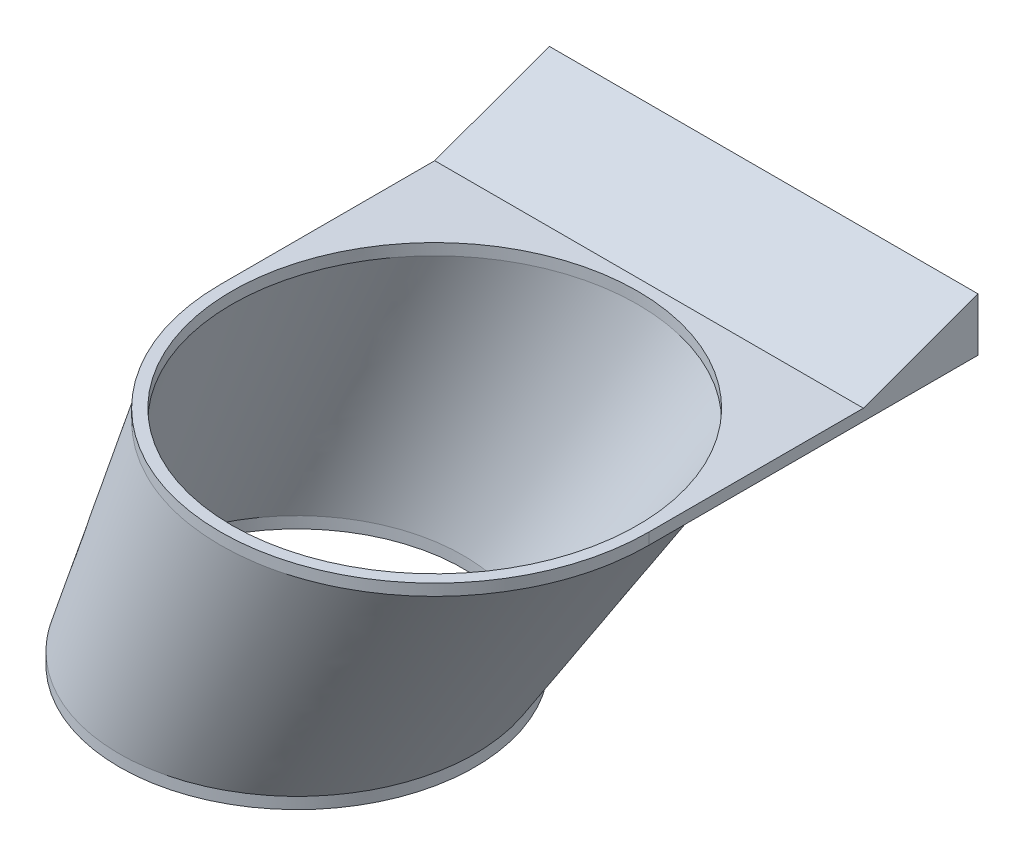
ISO-10303-21;
HEADER;
FILE_DESCRIPTION(('STEP AP214'),'2;1');
FILE_NAME('part.step','',(''),(''),'','','');
FILE_SCHEMA(('AUTOMOTIVE_DESIGN { 1 0 10303 214 1 1 1 1 }'));
ENDSEC;
DATA;
#1=APPLICATION_CONTEXT('core data for automotive mechanical design processes');
#2=APPLICATION_PROTOCOL_DEFINITION('international standard','automotive_design',2000,#1);
#3=PRODUCT_CONTEXT('',#1,'mechanical');
#4=PRODUCT('Part','Part','',(#3));
#5=PRODUCT_RELATED_PRODUCT_CATEGORY('part','',(#4));
#6=PRODUCT_DEFINITION_FORMATION('','',#4);
#7=PRODUCT_DEFINITION_CONTEXT('part definition',#1,'design');
#8=PRODUCT_DEFINITION('design','',#6,#7);
#9=PRODUCT_DEFINITION_SHAPE('','',#8);
#10=(LENGTH_UNIT() NAMED_UNIT(*) SI_UNIT(.MILLI.,.METRE.));
#11=(NAMED_UNIT(*) PLANE_ANGLE_UNIT() SI_UNIT($,.RADIAN.));
#12=(NAMED_UNIT(*) SI_UNIT($,.STERADIAN.) SOLID_ANGLE_UNIT());
#13=UNCERTAINTY_MEASURE_WITH_UNIT(LENGTH_MEASURE(1.E-05),#10,'distance_accuracy_value','');
#14=(GEOMETRIC_REPRESENTATION_CONTEXT(3) GLOBAL_UNCERTAINTY_ASSIGNED_CONTEXT((#13)) GLOBAL_UNIT_ASSIGNED_CONTEXT((#10,
#11,#12)) REPRESENTATION_CONTEXT('',''));
#15=CARTESIAN_POINT('',(0.,0.,0.));
#16=DIRECTION('',(0.,0.,1.));
#17=DIRECTION('',(1.,0.,0.));
#18=AXIS2_PLACEMENT_3D('',#15,#16,#17);
#19=CARTESIAN_POINT('',(0.,2.54,0.));
#20=DIRECTION('',(0.,-1.,0.));
#21=DIRECTION('',(0.,0.,-1.));
#22=AXIS2_PLACEMENT_3D('',#19,#20,#21);
#23=CYLINDRICAL_SURFACE('',#22,47.498);
#24=DIRECTION('',(0.,-1.,0.));
#25=VECTOR('',#24,1.);
#26=CARTESIAN_POINT('',(47.498,2.54,0.));
#27=LINE('',#26,#25);
#28=CARTESIAN_POINT('',(47.498,2.54,0.));
#29=VERTEX_POINT('',#28);
#30=CARTESIAN_POINT('',(47.498,0.,0.));
#31=VERTEX_POINT('',#30);
#32=EDGE_CURVE('E290',#29,#31,#27,.T.);
#33=ORIENTED_EDGE('',*,*,#32,.F.);
#34=CARTESIAN_POINT('',(0.,2.54,0.));
#35=DIRECTION('',(0.,1.,0.));
#36=DIRECTION('',(0.,0.,1.));
#37=AXIS2_PLACEMENT_3D('',#34,#35,#36);
#38=CIRCLE('',#37,47.498);
#39=CARTESIAN_POINT('',(-47.498,2.54,0.));
#40=VERTEX_POINT('',#39);
#41=EDGE_CURVE('E237',#40,#29,#38,.T.);
#42=ORIENTED_EDGE('',*,*,#41,.F.);
#43=DIRECTION('',(0.,-1.,0.));
#44=VECTOR('',#43,1.);
#45=CARTESIAN_POINT('',(-47.498,2.54,0.));
#46=LINE('',#45,#44);
#47=CARTESIAN_POINT('',(-47.498,0.,0.));
#48=VERTEX_POINT('',#47);
#49=EDGE_CURVE('E148',#40,#48,#46,.T.);
#50=ORIENTED_EDGE('',*,*,#49,.T.);
#51=CARTESIAN_POINT('',(0.,0.,0.));
#52=DIRECTION('',(0.,1.,0.));
#53=DIRECTION('',(0.,0.,1.));
#54=AXIS2_PLACEMENT_3D('',#51,#52,#53);
#55=CIRCLE('',#54,47.498);
#56=EDGE_CURVE('E88',#48,#31,#55,.T.);
#57=ORIENTED_EDGE('',*,*,#56,.T.);
#58=EDGE_LOOP('',(#33,#42,#50,#57));
#59=FACE_BOUND('',#58,.T.);
#60=ADVANCED_FACE('F83',(#59),#23,.T.);
#61=CARTESIAN_POINT('',(-30.48,-59.3725,0.));
#62=DIRECTION('',(0.,-1.,0.));
#63=DIRECTION('',(0.,0.,-1.));
#64=AXIS2_PLACEMENT_3D('',#61,#62,#63);
#65=CYLINDRICAL_SURFACE('',#64,39.37);
#66=CARTESIAN_POINT('',(-69.85,-59.3725,0.));
#67=CARTESIAN_POINT('',(-69.85,-59.3725,1.08644469703361));
#68=CARTESIAN_POINT('',(-69.7617944697033,-59.3725,3.23889515169413));
#69=CARTESIAN_POINT('',(-69.375034572002,-59.3725,6.39608902683125));
#70=CARTESIAN_POINT('',(-68.7439880606777,-59.3725,9.47163610648123));
#71=CARTESIAN_POINT('',(-63.552979242795,-59.3725,27.3740478796573));
#72=CARTESIAN_POINT('',(-47.863115152538,-59.3725,39.37));
#73=CARTESIAN_POINT('',(-8.75110605932756,-59.3725,39.37));
#74=CARTESIAN_POINT('',(8.89,-59.3725,21.7288939406725));
#75=CARTESIAN_POINT('',(8.89000000000001,-59.3725,-21.7288939406724));
#76=CARTESIAN_POINT('',(-8.75110605932754,-59.3725,-39.37));
#77=CARTESIAN_POINT('',(-47.8631151525379,-59.3725,-39.37));
#78=CARTESIAN_POINT('',(-63.552979242795,-59.3725,-27.3740478796573));
#79=CARTESIAN_POINT('',(-68.7439880606777,-59.3725,-9.47163610648125));
#80=CARTESIAN_POINT('',(-69.375034572002,-59.3725,-6.39608902683127));
#81=CARTESIAN_POINT('',(-69.7617944697033,-59.3725,-3.23889515169414));
#82=CARTESIAN_POINT('',(-69.85,-59.3725,-1.08644469703363));
#83=CARTESIAN_POINT('',(-69.85,-59.3725,0.));
#84=B_SPLINE_CURVE_WITH_KNOTS('',3,(#66,#67,#68,#69,#70,#71,#72,#73,#74,#75,#76,#77,#78,#79,#80,
#81,#82,#83),.UNSPECIFIED.,.T.,.F.,(4,1,1,1,1,2,2,2,1,1,1,1,4),(0.,0.0125,0.025,0.0375,0.05,
0.25,0.5,0.75,0.95,0.9625,0.975,0.9875,1.),.UNSPECIFIED.);
#85=CARTESIAN_POINT('',(-69.85,-59.3725,0.));
#86=VERTEX_POINT('',#85);
#87=EDGE_CURVE('E13',#86,#86,#84,.T.);
#88=ORIENTED_EDGE('',*,*,#87,.F.);
#89=EDGE_LOOP('',(#88));
#90=FACE_BOUND('',#89,.T.);
#91=CARTESIAN_POINT('',(-30.48,-61.9125,0.));
#92=DIRECTION('',(0.,1.,0.));
#93=DIRECTION('',(0.,0.,1.));
#94=AXIS2_PLACEMENT_3D('',#91,#92,#93);
#95=CIRCLE('',#94,39.37);
#96=CARTESIAN_POINT('',(-30.48,-61.9125,39.37));
#97=VERTEX_POINT('',#96);
#98=EDGE_CURVE('E94',#97,#97,#95,.T.);
#99=ORIENTED_EDGE('',*,*,#98,.T.);
#100=EDGE_LOOP('',(#99));
#101=FACE_BOUND('',#100,.T.);
#102=ADVANCED_FACE('F85',(#90,#101),#65,.T.);
#103=CARTESIAN_POINT('',(-30.48,-61.9125,0.));
#104=DIRECTION('',(0.,1.,0.));
#105=DIRECTION('',(0.,0.,1.));
#106=AXIS2_PLACEMENT_3D('',#103,#104,#105);
#107=PLANE('',#106);
#108=CARTESIAN_POINT('',(-30.48,-61.9125,0.));
#109=DIRECTION('',(0.,1.,0.));
#110=DIRECTION('',(0.,0.,1.));
#111=AXIS2_PLACEMENT_3D('',#108,#109,#110);
#112=CIRCLE('',#111,36.83);
#113=CARTESIAN_POINT('',(-30.48,-61.9125,36.83));
#114=VERTEX_POINT('',#113);
#115=EDGE_CURVE('E166',#114,#114,#112,.T.);
#116=ORIENTED_EDGE('',*,*,#115,.T.);
#117=EDGE_LOOP('',(#116));
#118=FACE_BOUND('',#117,.T.);
#119=ORIENTED_EDGE('',*,*,#98,.F.);
#120=EDGE_LOOP('',(#119));
#121=FACE_BOUND('',#120,.T.);
#122=ADVANCED_FACE('F210',(#118,#121),#107,.F.);
#123=CARTESIAN_POINT('',(-30.48,-61.9125,0.));
#124=DIRECTION('',(0.,1.,0.));
#125=DIRECTION('',(0.,0.,1.));
#126=AXIS2_PLACEMENT_3D('',#123,#124,#125);
#127=CYLINDRICAL_SURFACE('',#126,36.83);
#128=ORIENTED_EDGE('',*,*,#115,.F.);
#129=EDGE_LOOP('',(#128));
#130=FACE_BOUND('',#129,.T.);
#131=CARTESIAN_POINT('',(-30.48,-59.3725,0.));
#132=DIRECTION('',(0.,-1.,0.));
#133=DIRECTION('',(0.,0.,-1.));
#134=AXIS2_PLACEMENT_3D('',#131,#132,#133);
#135=CIRCLE('',#134,36.83);
#136=CARTESIAN_POINT('',(-67.31,-59.3725,0.));
#137=VERTEX_POINT('',#136);
#138=EDGE_CURVE('E194',#137,#137,#135,.T.);
#139=ORIENTED_EDGE('',*,*,#138,.F.);
#140=EDGE_LOOP('',(#139));
#141=FACE_BOUND('',#140,.T.);
#142=ADVANCED_FACE('F201',(#130,#141),#127,.F.);
#143=CARTESIAN_POINT('',(-47.498,0.,0.));
#144=CARTESIAN_POINT('',(-54.9486666666667,-19.7908333333333,0.));
#145=CARTESIAN_POINT('',(-62.3993333333333,-39.5816666666667,0.));
#146=CARTESIAN_POINT('',(-69.85,-59.3725,0.));
#147=CARTESIAN_POINT('',(-47.498,0.,-1.31074295706638));
#148=CARTESIAN_POINT('',(-54.9486666666667,-19.7908333333333,-1.2359768703888));
#149=CARTESIAN_POINT('',(-62.3993333333333,-39.5816666666667,-1.16121078371121));
#150=CARTESIAN_POINT('',(-69.85,-59.3725,-1.08644469703363));
#151=CARTESIAN_POINT('',(-47.3915842957066,0.,-3.90757027978584));
#152=CARTESIAN_POINT('',(-54.8483210203722,-19.7908333333333,-3.68467857042194));
#153=CARTESIAN_POINT('',(-62.3050577450378,-39.5816666666667,-3.46178686105804));
#154=CARTESIAN_POINT('',(-69.7617944697033,-59.3725,-3.23889515169414));
#155=CARTESIAN_POINT('',(-46.9249771933185,0.,-7.71657192269321));
#156=CARTESIAN_POINT('',(-54.4083296528797,-19.7908333333333,-7.2764109574059));
#157=CARTESIAN_POINT('',(-61.8916821124408,-39.5816666666667,-6.83624999211859));
#158=CARTESIAN_POINT('',(-69.375034572002,-59.3725,-6.39608902683127));
#159=CARTESIAN_POINT('',(-46.1636501119143,0.,-11.4270706574967));
#160=CARTESIAN_POINT('',(-53.6904294281688,-19.7908333333333,-10.7752591404916));
#161=CARTESIAN_POINT('',(-61.2172087444232,-39.5816666666667,-10.1234476234864));
#162=CARTESIAN_POINT('',(-68.7439880606777,-59.3725,-9.47163610648125));
#163=CARTESIAN_POINT('',(-39.9009491509849,0.,-33.0254642161027));
#164=CARTESIAN_POINT('',(-47.7849591815883,-19.7908333333333,-31.1416587706209));
#165=CARTESIAN_POINT('',(-55.6689692121916,-39.5816666666667,-29.2578533251391));
#166=CARTESIAN_POINT('',(-63.552979242795,-59.3725,-27.3740478796573));
#167=CARTESIAN_POINT('',(-20.9718873130619,0.,-47.498));
#168=CARTESIAN_POINT('',(-29.9356299262206,-19.7908333333333,-44.7886666666667));
#169=CARTESIAN_POINT('',(-38.8993725393793,-39.5816666666667,-42.0793333333333));
#170=CARTESIAN_POINT('',(-47.8631151525379,-59.3725,-39.37));
#171=CARTESIAN_POINT('',(26.2148591413274,0.,-47.498));
#172=CARTESIAN_POINT('',(14.5595374077758,-19.7908333333333,-44.7886666666667));
#173=CARTESIAN_POINT('',(2.90421567422411,-39.5816666666667,-42.0793333333333));
#174=CARTESIAN_POINT('',(-8.75110605932754,-59.3725,-39.37));
#175=CARTESIAN_POINT('',(47.498,0.,-26.2148591413274));
#176=CARTESIAN_POINT('',(34.6286666666667,-19.7908333333333,-24.7195374077757));
#177=CARTESIAN_POINT('',(21.7593333333333,-39.5816666666667,-23.2242156742241));
#178=CARTESIAN_POINT('',(8.89000000000001,-59.3725,-21.7288939406724));
#179=CARTESIAN_POINT('',(47.498,0.,26.2148591413274));
#180=CARTESIAN_POINT('',(34.6286666666667,-19.7908333333333,24.7195374077758));
#181=CARTESIAN_POINT('',(21.7593333333333,-39.5816666666667,23.2242156742241));
#182=CARTESIAN_POINT('',(8.89,-59.3725,21.7288939406725));
#183=CARTESIAN_POINT('',(26.2148591413274,0.,47.498));
#184=CARTESIAN_POINT('',(14.5595374077757,-19.7908333333333,44.7886666666667));
#185=CARTESIAN_POINT('',(2.90421567422409,-39.5816666666667,42.0793333333333));
#186=CARTESIAN_POINT('',(-8.75110605932756,-59.3725,39.37));
#187=CARTESIAN_POINT('',(-20.9718873130619,0.,47.498));
#188=CARTESIAN_POINT('',(-29.9356299262206,-19.7908333333333,44.7886666666667));
#189=CARTESIAN_POINT('',(-38.8993725393793,-39.5816666666667,42.0793333333333));
#190=CARTESIAN_POINT('',(-47.863115152538,-59.3725,39.37));
#191=CARTESIAN_POINT('',(-39.900949150985,0.,33.0254642161026));
#192=CARTESIAN_POINT('',(-47.7849591815883,-19.7908333333333,31.1416587706208));
#193=CARTESIAN_POINT('',(-55.6689692121917,-39.5816666666667,29.2578533251391));
#194=CARTESIAN_POINT('',(-63.552979242795,-59.3725,27.3740478796573));
#195=CARTESIAN_POINT('',(-46.1636501119143,0.,11.4270706574967));
#196=CARTESIAN_POINT('',(-53.6904294281688,-19.7908333333333,10.7752591404915));
#197=CARTESIAN_POINT('',(-61.2172087444232,-39.5816666666667,10.1234476234864));
#198=CARTESIAN_POINT('',(-68.7439880606777,-59.3725,9.47163610648123));
#199=CARTESIAN_POINT('',(-46.9249771933185,0.,7.71657192269318));
#200=CARTESIAN_POINT('',(-54.4083296528797,-19.7908333333333,7.27641095740587));
#201=CARTESIAN_POINT('',(-61.8916821124408,-39.5816666666667,6.83624999211856));
#202=CARTESIAN_POINT('',(-69.375034572002,-59.3725,6.39608902683125));
#203=CARTESIAN_POINT('',(-47.3915842957066,0.,3.90757027978582));
#204=CARTESIAN_POINT('',(-54.8483210203722,-19.7908333333333,3.68467857042192));
#205=CARTESIAN_POINT('',(-62.3050577450378,-39.5816666666667,3.46178686105803));
#206=CARTESIAN_POINT('',(-69.7617944697033,-59.3725,3.23889515169413));
#207=CARTESIAN_POINT('',(-47.498,0.,1.31074295706635));
#208=CARTESIAN_POINT('',(-54.9486666666667,-19.7908333333333,1.23597687038877));
#209=CARTESIAN_POINT('',(-62.3993333333333,-39.5816666666667,1.16121078371119));
#210=CARTESIAN_POINT('',(-69.85,-59.3725,1.08644469703361));
#211=CARTESIAN_POINT('',(-47.498,0.,0.));
#212=CARTESIAN_POINT('',(-54.9486666666667,-19.7908333333333,0.));
#213=CARTESIAN_POINT('',(-62.3993333333333,-39.5816666666667,0.));
#214=CARTESIAN_POINT('',(-69.85,-59.3725,0.));
#215=B_SPLINE_SURFACE_WITH_KNOTS('',3,3,((#143,#144,#145,#146),(#147,#148,#149,#150),(#151,#152,
#153,#154),(#155,#156,#157,#158),(#159,#160,#161,#162),(#163,#164,#165,#166),(#167,#168,#169,
#170),(#171,#172,#173,#174),(#175,#176,#177,#178),(#179,#180,#181,#182),(#183,#184,#185,#186),
(#187,#188,#189,#190),(#191,#192,#193,#194),(#195,#196,#197,#198),(#199,#200,#201,#202),(#203,
#204,#205,#206),(#207,#208,#209,#210),(#211,#212,#213,#214)),.UNSPECIFIED.,.T.,.F.,.F.,(4,1,1,1,
1,2,2,2,1,1,1,1,4),(4,4),(0.,0.0125,0.0249999999999999,0.0375000000000001,0.05,0.25,0.5,0.75,
0.95,0.9625,0.975,0.9875,1.),(0.,1.),.UNSPECIFIED.);
#216=EDGE_CURVE('E152',#31,#48,#55,.T.);
#217=ORIENTED_EDGE('',*,*,#216,.F.);
#218=ORIENTED_EDGE('',*,*,#56,.F.);
#219=EDGE_LOOP('',(#217,#218));
#220=FACE_BOUND('',#219,.T.);
#221=ORIENTED_EDGE('',*,*,#87,.T.);
#222=EDGE_LOOP('',(#221));
#223=FACE_BOUND('',#222,.T.);
#224=ADVANCED_FACE('F209',(#220,#223),#215,.T.);
#225=CARTESIAN_POINT('',(0.,2.54,0.));
#226=DIRECTION('',(0.,1.,0.));
#227=DIRECTION('',(0.,0.,1.));
#228=AXIS2_PLACEMENT_3D('',#225,#226,#227);
#229=PLANE('',#228);
#230=DIRECTION('',(1.,0.,0.));
#231=VECTOR('',#230,1.);
#232=CARTESIAN_POINT('',(47.498,2.54,-47.498));
#233=LINE('',#232,#231);
#234=CARTESIAN_POINT('',(-47.498,2.54,-47.498));
#235=VERTEX_POINT('',#234);
#236=CARTESIAN_POINT('',(47.498,2.54,-47.498));
#237=VERTEX_POINT('',#236);
#238=EDGE_CURVE('E277',#235,#237,#233,.T.);
#239=ORIENTED_EDGE('',*,*,#238,.F.);
#240=DIRECTION('',(0.,0.,1.));
#241=VECTOR('',#240,1.);
#242=CARTESIAN_POINT('',(-47.498,2.54,0.));
#243=LINE('',#242,#241);
#244=EDGE_CURVE('E101',#235,#40,#243,.T.);
#245=ORIENTED_EDGE('',*,*,#244,.T.);
#246=ORIENTED_EDGE('',*,*,#41,.T.);
#247=DIRECTION('',(0.,0.,-1.));
#248=VECTOR('',#247,1.);
#249=CARTESIAN_POINT('',(47.498,2.54,0.));
#250=LINE('',#249,#248);
#251=EDGE_CURVE('E110',#29,#237,#250,.T.);
#252=ORIENTED_EDGE('',*,*,#251,.T.);
#253=EDGE_LOOP('',(#239,#245,#246,#252));
#254=FACE_BOUND('',#253,.T.);
#255=CARTESIAN_POINT('',(0.,2.54,0.));
#256=DIRECTION('',(0.,-1.,0.));
#257=DIRECTION('',(0.,0.,-1.));
#258=AXIS2_PLACEMENT_3D('',#255,#256,#257);
#259=CIRCLE('',#258,44.958);
#260=CARTESIAN_POINT('',(0.,2.54,-44.958));
#261=VERTEX_POINT('',#260);
#262=EDGE_CURVE('E280',#261,#261,#259,.T.);
#263=ORIENTED_EDGE('',*,*,#262,.T.);
#264=EDGE_LOOP('',(#263));
#265=FACE_BOUND('',#264,.T.);
#266=ADVANCED_FACE('F230',(#254,#265),#229,.T.);
#267=CARTESIAN_POINT('',(0.,2.54,0.));
#268=DIRECTION('',(0.,-1.,0.));
#269=DIRECTION('',(0.,0.,-1.));
#270=AXIS2_PLACEMENT_3D('',#267,#268,#269);
#271=CYLINDRICAL_SURFACE('',#270,44.958);
#272=ORIENTED_EDGE('',*,*,#262,.F.);
#273=EDGE_LOOP('',(#272));
#274=FACE_BOUND('',#273,.T.);
#275=CARTESIAN_POINT('',(0.,0.,0.));
#276=DIRECTION('',(0.,1.,0.));
#277=DIRECTION('',(0.,0.,1.));
#278=AXIS2_PLACEMENT_3D('',#275,#276,#277);
#279=CIRCLE('',#278,44.958);
#280=CARTESIAN_POINT('',(-44.958,0.,0.));
#281=VERTEX_POINT('',#280);
#282=EDGE_CURVE('E281',#281,#281,#279,.T.);
#283=ORIENTED_EDGE('',*,*,#282,.F.);
#284=EDGE_LOOP('',(#283));
#285=FACE_BOUND('',#284,.T.);
#286=ADVANCED_FACE('F267',(#274,#285),#271,.F.);
#287=CARTESIAN_POINT('',(-44.958,0.,0.));
#288=CARTESIAN_POINT('',(-52.4086666666667,-19.7908333333333,0.));
#289=CARTESIAN_POINT('',(-59.8593333333333,-39.5816666666667,0.));
#290=CARTESIAN_POINT('',(-67.31,-59.3725,0.));
#291=CARTESIAN_POINT('',(-44.958,0.,-1.24064975080615));
#292=CARTESIAN_POINT('',(-52.4086666666667,-19.7908333333333,-1.16588366412856));
#293=CARTESIAN_POINT('',(-59.8593333333333,-39.5816666666667,-1.09111757745097));
#294=CARTESIAN_POINT('',(-67.31,-59.3725,-1.01635149077339));
#295=CARTESIAN_POINT('',(-44.8572749750806,0.,-3.69860930225718));
#296=CARTESIAN_POINT('',(-52.3140116997462,-19.7908333333333,-3.47571759289328));
#297=CARTESIAN_POINT('',(-59.7707484244118,-39.5816666666667,-3.25282588352938));
#298=CARTESIAN_POINT('',(-67.2274851490773,-59.3725,-3.02993417416548));
#299=CARTESIAN_POINT('',(-44.4156201241571,0.,-7.30392101773636));
#300=CARTESIAN_POINT('',(-51.8989725837182,-19.7908333333333,-6.86376005244904));
#301=CARTESIAN_POINT('',(-59.3823250432794,-39.5816666666667,-6.42359908716172));
#302=CARTESIAN_POINT('',(-66.8656775028406,-59.3725,-5.98343812187441));
#303=CARTESIAN_POINT('',(-43.6950057209029,0.,-10.8159973603044));
#304=CARTESIAN_POINT('',(-51.2217850371573,-19.7908333333333,-10.1641858432992));
#305=CARTESIAN_POINT('',(-58.7485643534118,-39.5816666666667,-9.51237432629407));
#306=CARTESIAN_POINT('',(-66.2753436696662,-59.3725,-8.8605628092889));
#307=CARTESIAN_POINT('',(-37.7672085546756,0.,-31.2593966109635));
#308=CARTESIAN_POINT('',(-45.6512185852789,-19.7908333333333,-29.3755911654817));
#309=CARTESIAN_POINT('',(-53.5352286158823,-39.5816666666667,-27.4917857199999));
#310=CARTESIAN_POINT('',(-61.4192386464857,-59.3725,-25.6079802745181));
#311=CARTESIAN_POINT('',(-19.8503960128982,0.,-44.958));
#312=CARTESIAN_POINT('',(-28.8141386260568,-19.7908333333333,-42.2486666666667));
#313=CARTESIAN_POINT('',(-37.7778812392155,-39.5816666666667,-39.5393333333333));
#314=CARTESIAN_POINT('',(-46.7416238523742,-59.3725,-36.83));
#315=CARTESIAN_POINT('',(24.8129950161227,0.,-44.958));
#316=CARTESIAN_POINT('',(13.1576732825711,-19.7908333333333,-42.2486666666667));
#317=CARTESIAN_POINT('',(1.50235154901943,-39.5816666666667,-39.5393333333333));
#318=CARTESIAN_POINT('',(-10.1529701845322,-59.3725,-36.83));
#319=CARTESIAN_POINT('',(44.958,0.,-24.8129950161227));
#320=CARTESIAN_POINT('',(32.0886666666667,-19.7908333333333,-23.3176732825711));
#321=CARTESIAN_POINT('',(19.2193333333333,-39.5816666666667,-21.8223515490194));
#322=CARTESIAN_POINT('',(6.35000000000001,-59.3725,-20.3270298154678));
#323=CARTESIAN_POINT('',(44.958,0.,24.8129950161227));
#324=CARTESIAN_POINT('',(32.0886666666667,-19.7908333333333,23.3176732825711));
#325=CARTESIAN_POINT('',(19.2193333333333,-39.5816666666667,21.8223515490194));
#326=CARTESIAN_POINT('',(6.35,-59.3725,20.3270298154678));
#327=CARTESIAN_POINT('',(24.8129950161227,0.,44.958));
#328=CARTESIAN_POINT('',(13.1576732825711,-19.7908333333333,42.2486666666667));
#329=CARTESIAN_POINT('',(1.50235154901943,-39.5816666666667,39.5393333333333));
#330=CARTESIAN_POINT('',(-10.1529701845322,-59.3725,36.83));
#331=CARTESIAN_POINT('',(-19.8503960128982,0.,44.958));
#332=CARTESIAN_POINT('',(-28.8141386260569,-19.7908333333333,42.2486666666667));
#333=CARTESIAN_POINT('',(-37.7778812392155,-39.5816666666667,39.5393333333333));
#334=CARTESIAN_POINT('',(-46.7416238523742,-59.3725,36.83));
#335=CARTESIAN_POINT('',(-37.7672085546756,0.,31.2593966109635));
#336=CARTESIAN_POINT('',(-45.6512185852789,-19.7908333333333,29.3755911654817));
#337=CARTESIAN_POINT('',(-53.5352286158823,-39.5816666666667,27.4917857199999));
#338=CARTESIAN_POINT('',(-61.4192386464856,-59.3725,25.6079802745181));
#339=CARTESIAN_POINT('',(-43.6950057209029,0.,10.8159973603044));
#340=CARTESIAN_POINT('',(-51.2217850371573,-19.7908333333333,10.1641858432992));
#341=CARTESIAN_POINT('',(-58.7485643534117,-39.5816666666667,9.51237432629405));
#342=CARTESIAN_POINT('',(-66.2753436696662,-59.3725,8.8605628092889));
#343=CARTESIAN_POINT('',(-44.4156201241571,0.,7.30392101773633));
#344=CARTESIAN_POINT('',(-51.8989725837182,-19.7908333333333,6.86376005244902));
#345=CARTESIAN_POINT('',(-59.3823250432794,-39.5816666666667,6.42359908716171));
#346=CARTESIAN_POINT('',(-66.8656775028406,-59.3725,5.9834381218744));
#347=CARTESIAN_POINT('',(-44.8572749750806,0.,3.69860930225717));
#348=CARTESIAN_POINT('',(-52.3140116997462,-19.7908333333333,3.47571759289327));
#349=CARTESIAN_POINT('',(-59.7707484244118,-39.5816666666667,3.25282588352938));
#350=CARTESIAN_POINT('',(-67.2274851490773,-59.3725,3.02993417416548));
#351=CARTESIAN_POINT('',(-44.958,0.,1.24064975080612));
#352=CARTESIAN_POINT('',(-52.4086666666667,-19.7908333333333,1.16588366412854));
#353=CARTESIAN_POINT('',(-59.8593333333333,-39.5816666666667,1.09111757745096));
#354=CARTESIAN_POINT('',(-67.31,-59.3725,1.01635149077338));
#355=CARTESIAN_POINT('',(-44.958,0.,0.));
#356=CARTESIAN_POINT('',(-52.4086666666667,-19.7908333333333,0.));
#357=CARTESIAN_POINT('',(-59.8593333333333,-39.5816666666667,0.));
#358=CARTESIAN_POINT('',(-67.31,-59.3725,0.));
#359=B_SPLINE_SURFACE_WITH_KNOTS('',3,3,((#287,#288,#289,#290),(#291,#292,#293,#294),(#295,#296,
#297,#298),(#299,#300,#301,#302),(#303,#304,#305,#306),(#307,#308,#309,#310),(#311,#312,#313,
#314),(#315,#316,#317,#318),(#319,#320,#321,#322),(#323,#324,#325,#326),(#327,#328,#329,#330),
(#331,#332,#333,#334),(#335,#336,#337,#338),(#339,#340,#341,#342),(#343,#344,#345,#346),(#347,
#348,#349,#350),(#351,#352,#353,#354),(#355,#356,#357,#358)),.UNSPECIFIED.,.T.,.F.,.F.,(4,1,1,1,
1,2,2,2,1,1,1,1,4),(4,4),(0.,0.0125,0.0249999999999999,0.0375000000000001,0.05,0.25,0.5,0.75,
0.95,0.9625,0.975,0.9875,1.),(0.,1.),.UNSPECIFIED.);
#360=CARTESIAN_POINT('',(-44.958,0.,0.));
#361=CARTESIAN_POINT('',(-45.1908333333333,-0.618463541666665,0.));
#362=CARTESIAN_POINT('',(-45.4236666666667,-1.23692708333333,0.));
#363=CARTESIAN_POINT('',(-45.8893333333333,-2.47385416666667,0.));
#364=CARTESIAN_POINT('',(-46.1221666666667,-3.09231770833334,0.));
#365=CARTESIAN_POINT('',(-46.5878333333333,-4.32924479166667,0.));
#366=CARTESIAN_POINT('',(-46.8206666666667,-4.94770833333333,0.));
#367=CARTESIAN_POINT('',(-47.2863333333333,-6.18463541666666,0.));
#368=CARTESIAN_POINT('',(-47.5191666666667,-6.80309895833333,0.));
#369=CARTESIAN_POINT('',(-47.9848333333333,-8.04002604166667,0.));
#370=CARTESIAN_POINT('',(-48.2176666666667,-8.65848958333333,0.));
#371=CARTESIAN_POINT('',(-48.6833333333333,-9.89541666666666,0.));
#372=CARTESIAN_POINT('',(-48.9161666666667,-10.5138802083333,0.));
#373=CARTESIAN_POINT('',(-49.3818333333333,-11.7508072916667,0.));
#374=CARTESIAN_POINT('',(-49.6146666666667,-12.3692708333333,0.));
#375=CARTESIAN_POINT('',(-50.0803333333333,-13.6061979166667,0.));
#376=CARTESIAN_POINT('',(-50.3131666666667,-14.2246614583333,0.));
#377=CARTESIAN_POINT('',(-50.7788333333333,-15.4615885416667,0.));
#378=CARTESIAN_POINT('',(-51.0116666666667,-16.0800520833333,0.));
#379=CARTESIAN_POINT('',(-51.4773333333333,-17.3169791666667,0.));
#380=CARTESIAN_POINT('',(-51.7101666666667,-17.9354427083333,0.));
#381=CARTESIAN_POINT('',(-52.1758333333333,-19.1723697916667,0.));
#382=CARTESIAN_POINT('',(-52.4086666666667,-19.7908333333333,0.));
#383=CARTESIAN_POINT('',(-52.8743333333333,-21.0277604166667,0.));
#384=CARTESIAN_POINT('',(-53.1071666666667,-21.6462239583333,0.));
#385=CARTESIAN_POINT('',(-53.5728333333333,-22.8831510416667,0.));
#386=CARTESIAN_POINT('',(-53.8056666666667,-23.5016145833333,0.));
#387=CARTESIAN_POINT('',(-54.2713333333333,-24.7385416666667,0.));
#388=CARTESIAN_POINT('',(-54.5041666666667,-25.3570052083333,0.));
#389=CARTESIAN_POINT('',(-54.9698333333333,-26.5939322916667,0.));
#390=CARTESIAN_POINT('',(-55.2026666666667,-27.2123958333333,0.));
#391=CARTESIAN_POINT('',(-55.6683333333333,-28.4493229166667,0.));
#392=CARTESIAN_POINT('',(-55.9011666666667,-29.0677864583333,0.));
#393=CARTESIAN_POINT('',(-56.3668333333333,-30.3047135416667,0.));
#394=CARTESIAN_POINT('',(-56.5996666666667,-30.9231770833333,0.));
#395=CARTESIAN_POINT('',(-57.0653333333333,-32.1601041666667,0.));
#396=CARTESIAN_POINT('',(-57.2981666666667,-32.7785677083333,0.));
#397=CARTESIAN_POINT('',(-57.7638333333333,-34.0154947916667,0.));
#398=CARTESIAN_POINT('',(-57.9966666666667,-34.6339583333333,0.));
#399=CARTESIAN_POINT('',(-58.4623333333333,-35.8708854166667,0.));
#400=CARTESIAN_POINT('',(-58.6951666666667,-36.4893489583333,0.));
#401=CARTESIAN_POINT('',(-59.1608333333333,-37.7262760416667,0.));
#402=CARTESIAN_POINT('',(-59.3936666666667,-38.3447395833333,0.));
#403=CARTESIAN_POINT('',(-59.8593333333333,-39.5816666666667,0.));
#404=CARTESIAN_POINT('',(-60.0921666666667,-40.2001302083333,0.));
#405=CARTESIAN_POINT('',(-60.5578333333333,-41.4370572916667,0.));
#406=CARTESIAN_POINT('',(-60.7906666666667,-42.0555208333333,0.));
#407=CARTESIAN_POINT('',(-61.2563333333333,-43.2924479166667,0.));
#408=CARTESIAN_POINT('',(-61.4891666666667,-43.9109114583333,0.));
#409=CARTESIAN_POINT('',(-61.9548333333333,-45.1478385416667,0.));
#410=CARTESIAN_POINT('',(-62.1876666666667,-45.7663020833333,0.));
#411=CARTESIAN_POINT('',(-62.6533333333333,-47.0032291666667,0.));
#412=CARTESIAN_POINT('',(-62.8861666666667,-47.6216927083333,0.));
#413=CARTESIAN_POINT('',(-63.3518333333333,-48.8586197916667,0.));
#414=CARTESIAN_POINT('',(-63.5846666666667,-49.4770833333333,0.));
#415=CARTESIAN_POINT('',(-64.0503333333333,-50.7140104166667,0.));
#416=CARTESIAN_POINT('',(-64.2831666666667,-51.3324739583333,0.));
#417=CARTESIAN_POINT('',(-64.7488333333333,-52.5694010416667,0.));
#418=CARTESIAN_POINT('',(-64.9816666666667,-53.1878645833333,0.));
#419=CARTESIAN_POINT('',(-65.4473333333333,-54.4247916666667,0.));
#420=CARTESIAN_POINT('',(-65.6801666666667,-55.0432552083333,0.));
#421=CARTESIAN_POINT('',(-66.1458333333333,-56.2801822916667,0.));
#422=CARTESIAN_POINT('',(-66.3786666666667,-56.8986458333333,0.));
#423=CARTESIAN_POINT('',(-66.8443333333333,-58.1355729166667,0.));
#424=CARTESIAN_POINT('',(-67.0771666666667,-58.7540364583333,0.));
#425=CARTESIAN_POINT('',(-67.31,-59.3725,0.));
#426=B_SPLINE_CURVE_WITH_KNOTS('',3,(#360,#361,#362,#363,#364,#365,#366,#367,#368,#369,#370,
#371,#372,#373,#374,#375,#376,#377,#378,#379,#380,#381,#382,#383,#384,#385,#386,#387,#388,#389,
#390,#391,#392,#393,#394,#395,#396,#397,#398,#399,#400,#401,#402,#403,#404,#405,#406,#407,#408,
#409,#410,#411,#412,#413,#414,#415,#416,#417,#418,#419,#420,#421,#422,#423,#424,#425),
.UNSPECIFIED.,.F.,.F.,(4,2,2,2,2,2,2,2,2,2,2,2,2,2,2,2,2,2,2,2,2,2,2,2,2,2,2,2,2,2,2,2,4),(0.,
1.98251774805117,3.96503549610234,5.94755324415352,7.93007099220469,9.91258874025586,
11.895106488307,13.8776242363582,15.8601419844094,17.8426597324605,19.8251774805117,
21.8076952285629,23.7902129766141,25.7727307246652,27.7552484727164,29.7377662207676,
31.7202839688187,33.7028017168699,35.6853194649211,37.6678372129723,39.6503549610234,
41.6328727090746,43.6153904571258,45.5979082051769,47.5804259532281,49.5629437012793,
51.5454614493305,53.5279791973816,55.5104969454328,57.493014693484,59.4755324415351,
61.4580501895863,63.4405679376375),.UNSPECIFIED.);
#427=EDGE_CURVE('BSEAM272',#281,#137,#426,.T.);
#428=ORIENTED_EDGE('',*,*,#282,.T.);
#429=ORIENTED_EDGE('',*,*,#138,.T.);
#430=ORIENTED_EDGE('',*,*,#427,.T.);
#431=ORIENTED_EDGE('',*,*,#427,.F.);
#432=EDGE_LOOP('',(#428,#430,#429,#431));
#433=FACE_BOUND('',#432,.T.);
#434=ADVANCED_FACE('F272',(#433),#359,.F.);
#435=CARTESIAN_POINT('',(47.498,2.54,0.));
#436=DIRECTION('',(-1.,0.,0.));
#437=DIRECTION('',(0.,0.,1.));
#438=AXIS2_PLACEMENT_3D('',#435,#436,#437);
#439=PLANE('',#438);
#440=DIRECTION('',(0.,-1.,0.));
#441=VECTOR('',#440,1.);
#442=CARTESIAN_POINT('',(47.498,2.54,-72.898));
#443=LINE('',#442,#441);
#444=CARTESIAN_POINT('',(47.498,11.785016308,-72.898));
#445=VERTEX_POINT('',#444);
#446=CARTESIAN_POINT('',(47.498,0.,-72.898));
#447=VERTEX_POINT('',#446);
#448=EDGE_CURVE('E136',#445,#447,#443,.T.);
#449=ORIENTED_EDGE('',*,*,#448,.F.);
#450=DIRECTION('',(0.,0.342025773901956,-0.939690571404634));
#451=VECTOR('',#450,1.);
#452=CARTESIAN_POINT('',(47.498,2.54,-47.498));
#453=LINE('',#452,#451);
#454=EDGE_CURVE('E331',#237,#445,#453,.T.);
#455=ORIENTED_EDGE('',*,*,#454,.F.);
#456=ORIENTED_EDGE('',*,*,#251,.F.);
#457=ORIENTED_EDGE('',*,*,#32,.T.);
#458=DIRECTION('',(0.,0.,-1.));
#459=VECTOR('',#458,1.);
#460=CARTESIAN_POINT('',(47.498,0.,0.));
#461=LINE('',#460,#459);
#462=EDGE_CURVE('E140',#31,#447,#461,.T.);
#463=ORIENTED_EDGE('',*,*,#462,.T.);
#464=EDGE_LOOP('',(#449,#455,#456,#457,#463));
#465=FACE_BOUND('',#464,.T.);
#466=ADVANCED_FACE('F305',(#465),#439,.F.);
#467=CARTESIAN_POINT('',(-47.498,2.54,-72.898));
#468=DIRECTION('',(0.,0.,1.));
#469=DIRECTION('',(1.,0.,0.));
#470=AXIS2_PLACEMENT_3D('',#467,#468,#469);
#471=PLANE('',#470);
#472=DIRECTION('',(-1.,0.,0.));
#473=VECTOR('',#472,1.);
#474=CARTESIAN_POINT('',(-47.498,0.,-72.898));
#475=LINE('',#474,#473);
#476=CARTESIAN_POINT('',(-47.498,0.,-72.898));
#477=VERTEX_POINT('',#476);
#478=EDGE_CURVE('E129',#447,#477,#475,.T.);
#479=ORIENTED_EDGE('',*,*,#478,.T.);
#480=DIRECTION('',(0.,-1.,0.));
#481=VECTOR('',#480,1.);
#482=CARTESIAN_POINT('',(-47.498,2.54,-72.898));
#483=LINE('',#482,#481);
#484=CARTESIAN_POINT('',(-47.498,11.785016308,-72.898));
#485=VERTEX_POINT('',#484);
#486=EDGE_CURVE('E134',#485,#477,#483,.T.);
#487=ORIENTED_EDGE('',*,*,#486,.F.);
#488=DIRECTION('',(-1.,0.,0.));
#489=VECTOR('',#488,1.);
#490=CARTESIAN_POINT('',(47.498,11.785016308,-72.898));
#491=LINE('',#490,#489);
#492=EDGE_CURVE('E327',#445,#485,#491,.T.);
#493=ORIENTED_EDGE('',*,*,#492,.F.);
#494=ORIENTED_EDGE('',*,*,#448,.T.);
#495=EDGE_LOOP('',(#479,#487,#493,#494));
#496=FACE_BOUND('',#495,.T.);
#497=ADVANCED_FACE('F131',(#496),#471,.F.);
#498=CARTESIAN_POINT('',(-47.498,2.54,0.));
#499=DIRECTION('',(1.,0.,0.));
#500=DIRECTION('',(0.,0.,-1.));
#501=AXIS2_PLACEMENT_3D('',#498,#499,#500);
#502=PLANE('',#501);
#503=ORIENTED_EDGE('',*,*,#244,.F.);
#504=DIRECTION('',(0.,0.342025773901956,-0.939690571404634));
#505=VECTOR('',#504,1.);
#506=CARTESIAN_POINT('',(-47.498,-12.7257809615796,-5.55639346236849));
#507=LINE('',#506,#505);
#508=EDGE_CURVE('E147',#235,#485,#507,.T.);
#509=ORIENTED_EDGE('',*,*,#508,.T.);
#510=ORIENTED_EDGE('',*,*,#486,.T.);
#511=DIRECTION('',(0.,0.,1.));
#512=VECTOR('',#511,1.);
#513=CARTESIAN_POINT('',(-47.498,0.,0.));
#514=LINE('',#513,#512);
#515=EDGE_CURVE('E139',#477,#48,#514,.T.);
#516=ORIENTED_EDGE('',*,*,#515,.T.);
#517=ORIENTED_EDGE('',*,*,#49,.F.);
#518=EDGE_LOOP('',(#503,#509,#510,#516,#517));
#519=FACE_BOUND('',#518,.T.);
#520=ADVANCED_FACE('F144',(#519),#502,.F.);
#521=CARTESIAN_POINT('',(0.,0.,0.));
#522=DIRECTION('',(0.,1.,0.));
#523=DIRECTION('',(0.,0.,1.));
#524=AXIS2_PLACEMENT_3D('',#521,#522,#523);
#525=PLANE('',#524);
#526=ORIENTED_EDGE('',*,*,#216,.T.);
#527=ORIENTED_EDGE('',*,*,#515,.F.);
#528=ORIENTED_EDGE('',*,*,#478,.F.);
#529=ORIENTED_EDGE('',*,*,#462,.F.);
#530=EDGE_LOOP('',(#526,#527,#528,#529));
#531=FACE_BOUND('',#530,.T.);
#532=ADVANCED_FACE('F150',(#531),#525,.F.);
#533=CARTESIAN_POINT('',(-70.7229036003911,2.54,-47.498));
#534=DIRECTION('',(0.,-0.939690571404634,-0.342025773901956));
#535=DIRECTION('',(0.,0.342025773901956,-0.939690571404634));
#536=AXIS2_PLACEMENT_3D('',#533,#534,#535);
#537=PLANE('',#536);
#538=ORIENTED_EDGE('',*,*,#238,.T.);
#539=ORIENTED_EDGE('',*,*,#454,.T.);
#540=ORIENTED_EDGE('',*,*,#492,.T.);
#541=ORIENTED_EDGE('',*,*,#508,.F.);
#542=EDGE_LOOP('',(#538,#539,#540,#541));
#543=FACE_BOUND('',#542,.T.);
#544=ADVANCED_FACE('F334',(#543),#537,.F.);
#545=CLOSED_SHELL('',(#60,#102,#122,#142,#224,#266,#286,#434,#466,#497,#520,#532,#544));
#546=MANIFOLD_SOLID_BREP('B2',#545);
#547=ADVANCED_BREP_SHAPE_REPRESENTATION('',(#18,#546),#14);
#548=SHAPE_DEFINITION_REPRESENTATION(#9,#547);
ENDSEC;
END-ISO-10303-21;
